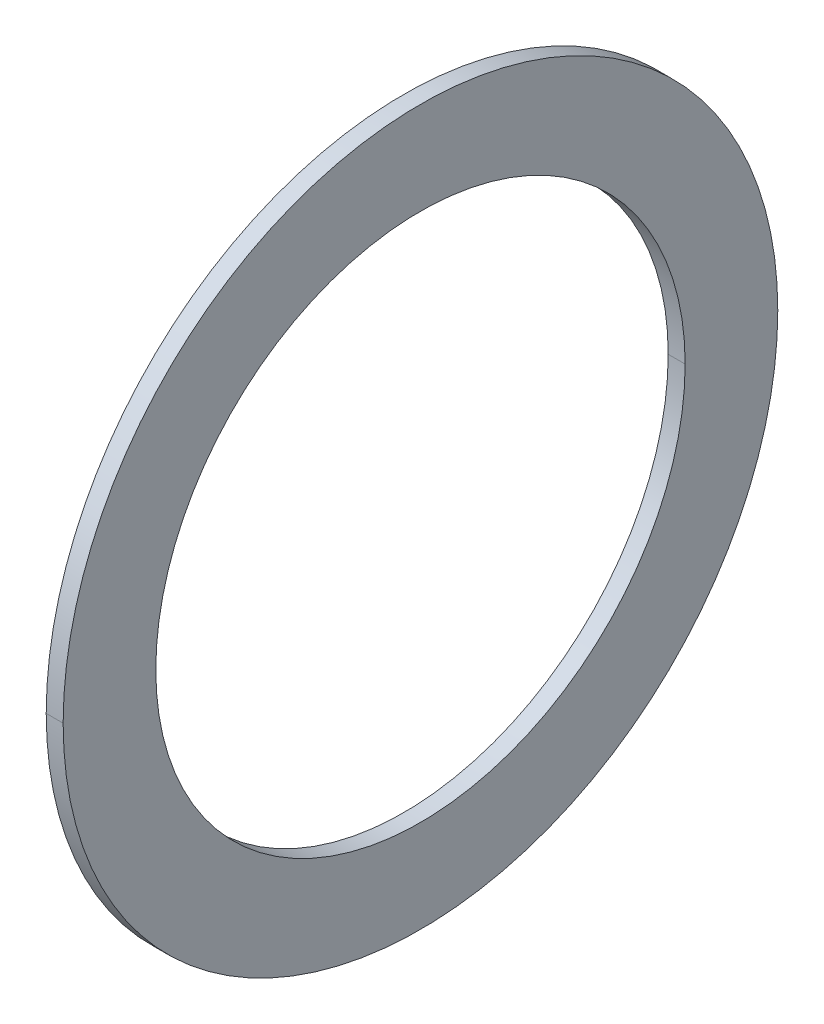
ISO-10303-21;
HEADER;
FILE_DESCRIPTION(('STEP AP214'),'2;1');
FILE_NAME('part.step','',(''),(''),'','','');
FILE_SCHEMA(('AUTOMOTIVE_DESIGN { 1 0 10303 214 1 1 1 1 }'));
ENDSEC;
DATA;
#1=APPLICATION_CONTEXT('core data for automotive mechanical design processes');
#2=APPLICATION_PROTOCOL_DEFINITION('international standard','automotive_design',2000,#1);
#3=PRODUCT_CONTEXT('',#1,'mechanical');
#4=PRODUCT('Part','Part','',(#3));
#5=PRODUCT_RELATED_PRODUCT_CATEGORY('part','',(#4));
#6=PRODUCT_DEFINITION_FORMATION('','',#4);
#7=PRODUCT_DEFINITION_CONTEXT('part definition',#1,'design');
#8=PRODUCT_DEFINITION('design','',#6,#7);
#9=PRODUCT_DEFINITION_SHAPE('','',#8);
#10=(LENGTH_UNIT() NAMED_UNIT(*) SI_UNIT(.MILLI.,.METRE.));
#11=(NAMED_UNIT(*) PLANE_ANGLE_UNIT() SI_UNIT($,.RADIAN.));
#12=(NAMED_UNIT(*) SI_UNIT($,.STERADIAN.) SOLID_ANGLE_UNIT());
#13=UNCERTAINTY_MEASURE_WITH_UNIT(LENGTH_MEASURE(1.E-05),#10,'distance_accuracy_value','');
#14=(GEOMETRIC_REPRESENTATION_CONTEXT(3) GLOBAL_UNCERTAINTY_ASSIGNED_CONTEXT((#13)) GLOBAL_UNIT_ASSIGNED_CONTEXT((#10,
#11,#12)) REPRESENTATION_CONTEXT('',''));
#15=CARTESIAN_POINT('',(0.,0.,0.));
#16=DIRECTION('',(0.,0.,1.));
#17=DIRECTION('',(1.,0.,0.));
#18=AXIS2_PLACEMENT_3D('',#15,#16,#17);
#19=CARTESIAN_POINT('',(1.6,0.,0.));
#20=DIRECTION('',(-1.,0.,0.));
#21=DIRECTION('',(0.,1.,0.));
#22=AXIS2_PLACEMENT_3D('',#19,#20,#21);
#23=CYLINDRICAL_SURFACE('',#22,50.);
#24=DIRECTION('',(-1.,0.,0.));
#25=VECTOR('',#24,1.);
#26=CARTESIAN_POINT('',(1.6,0.,-50.));
#27=LINE('',#26,#25);
#28=CARTESIAN_POINT('',(1.6,0.,-50.));
#29=VERTEX_POINT('',#28);
#30=CARTESIAN_POINT('',(-1.6,0.,-50.));
#31=VERTEX_POINT('',#30);
#32=EDGE_CURVE('E10',#29,#31,#27,.T.);
#33=ORIENTED_EDGE('',*,*,#32,.T.);
#34=CARTESIAN_POINT('',(-1.6,0.,0.));
#35=DIRECTION('',(1.,0.,0.));
#36=DIRECTION('',(0.,0.,-1.));
#37=AXIS2_PLACEMENT_3D('',#34,#35,#36);
#38=CIRCLE('',#37,50.);
#39=CARTESIAN_POINT('',(-1.6,0.,50.));
#40=VERTEX_POINT('',#39);
#41=EDGE_CURVE('E24',#40,#31,#38,.T.);
#42=ORIENTED_EDGE('',*,*,#41,.F.);
#43=DIRECTION('',(-1.,0.,0.));
#44=VECTOR('',#43,1.);
#45=CARTESIAN_POINT('',(1.6,0.,50.));
#46=LINE('',#45,#44);
#47=CARTESIAN_POINT('',(1.6,0.,50.));
#48=VERTEX_POINT('',#47);
#49=EDGE_CURVE('E93',#48,#40,#46,.T.);
#50=ORIENTED_EDGE('',*,*,#49,.F.);
#51=CARTESIAN_POINT('',(1.6,0.,0.));
#52=DIRECTION('',(1.,0.,0.));
#53=DIRECTION('',(0.,0.,-1.));
#54=AXIS2_PLACEMENT_3D('',#51,#52,#53);
#55=CIRCLE('',#54,50.);
#56=EDGE_CURVE('E89',#48,#29,#55,.T.);
#57=ORIENTED_EDGE('',*,*,#56,.T.);
#58=EDGE_LOOP('',(#33,#42,#50,#57));
#59=FACE_BOUND('',#58,.T.);
#60=ADVANCED_FACE('F16',(#59),#23,.F.);
#61=CARTESIAN_POINT('',(1.6,0.,0.));
#62=DIRECTION('',(1.,0.,0.));
#63=DIRECTION('',(0.,0.,-1.));
#64=AXIS2_PLACEMENT_3D('',#61,#62,#63);
#65=PLANE('',#64);
#66=ORIENTED_EDGE('',*,*,#56,.F.);
#67=CARTESIAN_POINT('',(1.6,0.,0.));
#68=DIRECTION('',(1.,0.,0.));
#69=DIRECTION('',(0.,0.,-1.));
#70=AXIS2_PLACEMENT_3D('',#67,#68,#69);
#71=CIRCLE('',#70,50.);
#72=EDGE_CURVE('E84',#29,#48,#71,.T.);
#73=ORIENTED_EDGE('',*,*,#72,.F.);
#74=EDGE_LOOP('',(#66,#73));
#75=FACE_BOUND('',#74,.T.);
#76=CARTESIAN_POINT('',(1.6,0.,0.));
#77=DIRECTION('',(1.,0.,0.));
#78=DIRECTION('',(0.,0.,-1.));
#79=AXIS2_PLACEMENT_3D('',#76,#77,#78);
#80=CIRCLE('',#79,67.5);
#81=CARTESIAN_POINT('',(1.6,0.,-67.5));
#82=VERTEX_POINT('',#81);
#83=CARTESIAN_POINT('',(1.6,0.,67.5));
#84=VERTEX_POINT('',#83);
#85=EDGE_CURVE('E71',#82,#84,#80,.T.);
#86=ORIENTED_EDGE('',*,*,#85,.T.);
#87=CARTESIAN_POINT('',(1.6,0.,0.));
#88=DIRECTION('',(1.,0.,0.));
#89=DIRECTION('',(0.,0.,-1.));
#90=AXIS2_PLACEMENT_3D('',#87,#88,#89);
#91=CIRCLE('',#90,67.5);
#92=EDGE_CURVE('E72',#84,#82,#91,.T.);
#93=ORIENTED_EDGE('',*,*,#92,.T.);
#94=EDGE_LOOP('',(#86,#93));
#95=FACE_BOUND('',#94,.T.);
#96=ADVANCED_FACE('F115',(#75,#95),#65,.T.);
#97=CARTESIAN_POINT('',(1.6,0.,0.));
#98=DIRECTION('',(-1.,0.,0.));
#99=DIRECTION('',(0.,1.,0.));
#100=AXIS2_PLACEMENT_3D('',#97,#98,#99);
#101=CYLINDRICAL_SURFACE('',#100,67.5);
#102=DIRECTION('',(-1.,0.,0.));
#103=VECTOR('',#102,1.);
#104=CARTESIAN_POINT('',(1.6,0.,-67.5));
#105=LINE('',#104,#103);
#106=CARTESIAN_POINT('',(-1.6,0.,-67.5));
#107=VERTEX_POINT('',#106);
#108=EDGE_CURVE('E58',#82,#107,#105,.T.);
#109=ORIENTED_EDGE('',*,*,#108,.F.);
#110=ORIENTED_EDGE('',*,*,#92,.F.);
#111=DIRECTION('',(-1.,0.,0.));
#112=VECTOR('',#111,1.);
#113=CARTESIAN_POINT('',(1.6,0.,67.5));
#114=LINE('',#113,#112);
#115=CARTESIAN_POINT('',(-1.6,0.,67.5));
#116=VERTEX_POINT('',#115);
#117=EDGE_CURVE('E60',#84,#116,#114,.T.);
#118=ORIENTED_EDGE('',*,*,#117,.T.);
#119=CARTESIAN_POINT('',(-1.6,0.,0.));
#120=DIRECTION('',(1.,0.,0.));
#121=DIRECTION('',(0.,0.,-1.));
#122=AXIS2_PLACEMENT_3D('',#119,#120,#121);
#123=CIRCLE('',#122,67.5);
#124=EDGE_CURVE('E53',#116,#107,#123,.T.);
#125=ORIENTED_EDGE('',*,*,#124,.T.);
#126=EDGE_LOOP('',(#109,#110,#118,#125));
#127=FACE_BOUND('',#126,.T.);
#128=ADVANCED_FACE('F55',(#127),#101,.T.);
#129=CARTESIAN_POINT('',(-1.6,0.,0.));
#130=DIRECTION('',(1.,0.,0.));
#131=DIRECTION('',(0.,0.,-1.));
#132=AXIS2_PLACEMENT_3D('',#129,#130,#131);
#133=PLANE('',#132);
#134=CARTESIAN_POINT('',(-1.6,0.,0.));
#135=DIRECTION('',(1.,0.,0.));
#136=DIRECTION('',(0.,0.,-1.));
#137=AXIS2_PLACEMENT_3D('',#134,#135,#136);
#138=CIRCLE('',#137,50.);
#139=EDGE_CURVE('E63',#31,#40,#138,.T.);
#140=ORIENTED_EDGE('',*,*,#139,.T.);
#141=ORIENTED_EDGE('',*,*,#41,.T.);
#142=EDGE_LOOP('',(#140,#141));
#143=FACE_BOUND('',#142,.T.);
#144=ORIENTED_EDGE('',*,*,#124,.F.);
#145=CARTESIAN_POINT('',(-1.6,0.,0.));
#146=DIRECTION('',(1.,0.,0.));
#147=DIRECTION('',(0.,0.,-1.));
#148=AXIS2_PLACEMENT_3D('',#145,#146,#147);
#149=CIRCLE('',#148,67.5);
#150=EDGE_CURVE('E65',#107,#116,#149,.T.);
#151=ORIENTED_EDGE('',*,*,#150,.F.);
#152=EDGE_LOOP('',(#144,#151));
#153=FACE_BOUND('',#152,.T.);
#154=ADVANCED_FACE('F66',(#143,#153),#133,.F.);
#155=CARTESIAN_POINT('',(1.6,0.,0.));
#156=DIRECTION('',(-1.,0.,0.));
#157=DIRECTION('',(0.,-1.,0.));
#158=AXIS2_PLACEMENT_3D('',#155,#156,#157);
#159=CYLINDRICAL_SURFACE('',#158,67.5);
#160=ORIENTED_EDGE('',*,*,#108,.T.);
#161=ORIENTED_EDGE('',*,*,#150,.T.);
#162=ORIENTED_EDGE('',*,*,#117,.F.);
#163=ORIENTED_EDGE('',*,*,#85,.F.);
#164=EDGE_LOOP('',(#160,#161,#162,#163));
#165=FACE_BOUND('',#164,.T.);
#166=ADVANCED_FACE('F70',(#165),#159,.T.);
#167=CARTESIAN_POINT('',(1.6,0.,0.));
#168=DIRECTION('',(-1.,0.,0.));
#169=DIRECTION('',(0.,-1.,0.));
#170=AXIS2_PLACEMENT_3D('',#167,#168,#169);
#171=CYLINDRICAL_SURFACE('',#170,50.);
#172=ORIENTED_EDGE('',*,*,#32,.F.);
#173=ORIENTED_EDGE('',*,*,#72,.T.);
#174=ORIENTED_EDGE('',*,*,#49,.T.);
#175=ORIENTED_EDGE('',*,*,#139,.F.);
#176=EDGE_LOOP('',(#172,#173,#174,#175));
#177=FACE_BOUND('',#176,.T.);
#178=ADVANCED_FACE('F111',(#177),#171,.F.);
#179=CLOSED_SHELL('',(#60,#96,#128,#154,#166,#178));
#180=MANIFOLD_SOLID_BREP('B1',#179);
#181=ADVANCED_BREP_SHAPE_REPRESENTATION('',(#18,#180),#14);
#182=SHAPE_DEFINITION_REPRESENTATION(#9,#181);
ENDSEC;
END-ISO-10303-21;
